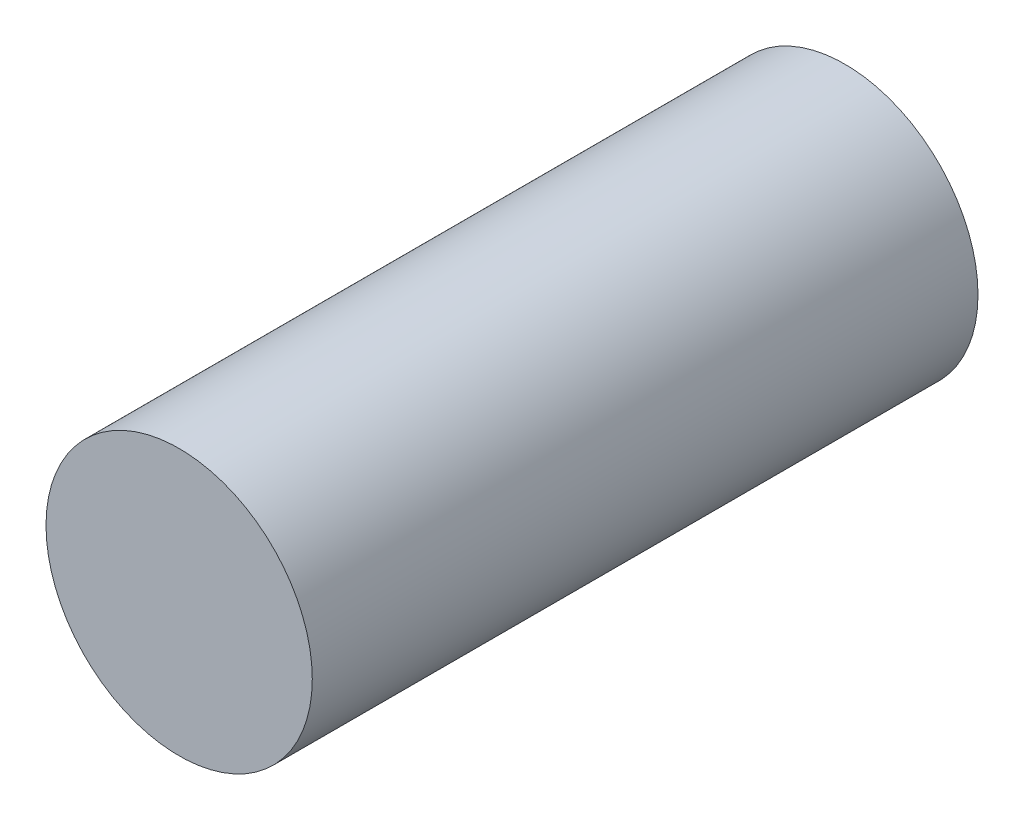
ISO-10303-21;
HEADER;
FILE_DESCRIPTION(('STEP AP214'),'2;1');
FILE_NAME('part.step','',(''),(''),'','','');
FILE_SCHEMA(('AUTOMOTIVE_DESIGN { 1 0 10303 214 1 1 1 1 }'));
ENDSEC;
DATA;
#1=APPLICATION_CONTEXT('core data for automotive mechanical design processes');
#2=APPLICATION_PROTOCOL_DEFINITION('international standard','automotive_design',2000,#1);
#3=PRODUCT_CONTEXT('',#1,'mechanical');
#4=PRODUCT('Part','Part','',(#3));
#5=PRODUCT_RELATED_PRODUCT_CATEGORY('part','',(#4));
#6=PRODUCT_DEFINITION_FORMATION('','',#4);
#7=PRODUCT_DEFINITION_CONTEXT('part definition',#1,'design');
#8=PRODUCT_DEFINITION('design','',#6,#7);
#9=PRODUCT_DEFINITION_SHAPE('','',#8);
#10=(LENGTH_UNIT() NAMED_UNIT(*) SI_UNIT(.MILLI.,.METRE.));
#11=(NAMED_UNIT(*) PLANE_ANGLE_UNIT() SI_UNIT($,.RADIAN.));
#12=(NAMED_UNIT(*) SI_UNIT($,.STERADIAN.) SOLID_ANGLE_UNIT());
#13=UNCERTAINTY_MEASURE_WITH_UNIT(LENGTH_MEASURE(1.E-05),#10,'distance_accuracy_value','');
#14=(GEOMETRIC_REPRESENTATION_CONTEXT(3) GLOBAL_UNCERTAINTY_ASSIGNED_CONTEXT((#13)) GLOBAL_UNIT_ASSIGNED_CONTEXT((#10,
#11,#12)) REPRESENTATION_CONTEXT('',''));
#15=CARTESIAN_POINT('',(0.,0.,0.));
#16=DIRECTION('',(0.,0.,1.));
#17=DIRECTION('',(1.,0.,0.));
#18=AXIS2_PLACEMENT_3D('',#15,#16,#17);
#19=CARTESIAN_POINT('',(0.,0.,2.5));
#20=DIRECTION('',(0.,0.,-1.));
#21=DIRECTION('',(-1.,0.,0.));
#22=AXIS2_PLACEMENT_3D('',#19,#20,#21);
#23=CYLINDRICAL_SURFACE('',#22,0.5);
#24=CARTESIAN_POINT('',(0.,0.,2.5));
#25=DIRECTION('',(0.,0.,1.));
#26=DIRECTION('',(1.,0.,0.));
#27=AXIS2_PLACEMENT_3D('',#24,#25,#26);
#28=CIRCLE('',#27,0.5);
#29=CARTESIAN_POINT('',(0.5,0.,2.5));
#30=VERTEX_POINT('',#29);
#31=EDGE_CURVE('E10',#30,#30,#28,.T.);
#32=ORIENTED_EDGE('',*,*,#31,.F.);
#33=EDGE_LOOP('',(#32));
#34=FACE_BOUND('',#33,.T.);
#35=CARTESIAN_POINT('',(0.,0.,0.));
#36=DIRECTION('',(0.,0.,1.));
#37=DIRECTION('',(1.,0.,0.));
#38=AXIS2_PLACEMENT_3D('',#35,#36,#37);
#39=CIRCLE('',#38,0.5);
#40=CARTESIAN_POINT('',(0.5,0.,0.));
#41=VERTEX_POINT('',#40);
#42=EDGE_CURVE('E36',#41,#41,#39,.T.);
#43=ORIENTED_EDGE('',*,*,#42,.T.);
#44=EDGE_LOOP('',(#43));
#45=FACE_BOUND('',#44,.T.);
#46=ADVANCED_FACE('F33',(#34,#45),#23,.T.);
#47=CARTESIAN_POINT('',(0.,0.,2.5));
#48=DIRECTION('',(0.,0.,1.));
#49=DIRECTION('',(1.,0.,0.));
#50=AXIS2_PLACEMENT_3D('',#47,#48,#49);
#51=PLANE('',#50);
#52=ORIENTED_EDGE('',*,*,#31,.T.);
#53=EDGE_LOOP('',(#52));
#54=FACE_BOUND('',#53,.T.);
#55=ADVANCED_FACE('F48',(#54),#51,.T.);
#56=CARTESIAN_POINT('',(0.,0.,0.));
#57=DIRECTION('',(0.,0.,1.));
#58=DIRECTION('',(1.,0.,0.));
#59=AXIS2_PLACEMENT_3D('',#56,#57,#58);
#60=PLANE('',#59);
#61=ORIENTED_EDGE('',*,*,#42,.F.);
#62=EDGE_LOOP('',(#61));
#63=FACE_BOUND('',#62,.T.);
#64=ADVANCED_FACE('F46',(#63),#60,.F.);
#65=CLOSED_SHELL('',(#46,#55,#64));
#66=MANIFOLD_SOLID_BREP('B2',#65);
#67=ADVANCED_BREP_SHAPE_REPRESENTATION('',(#18,#66),#14);
#68=SHAPE_DEFINITION_REPRESENTATION(#9,#67);
ENDSEC;
END-ISO-10303-21;
